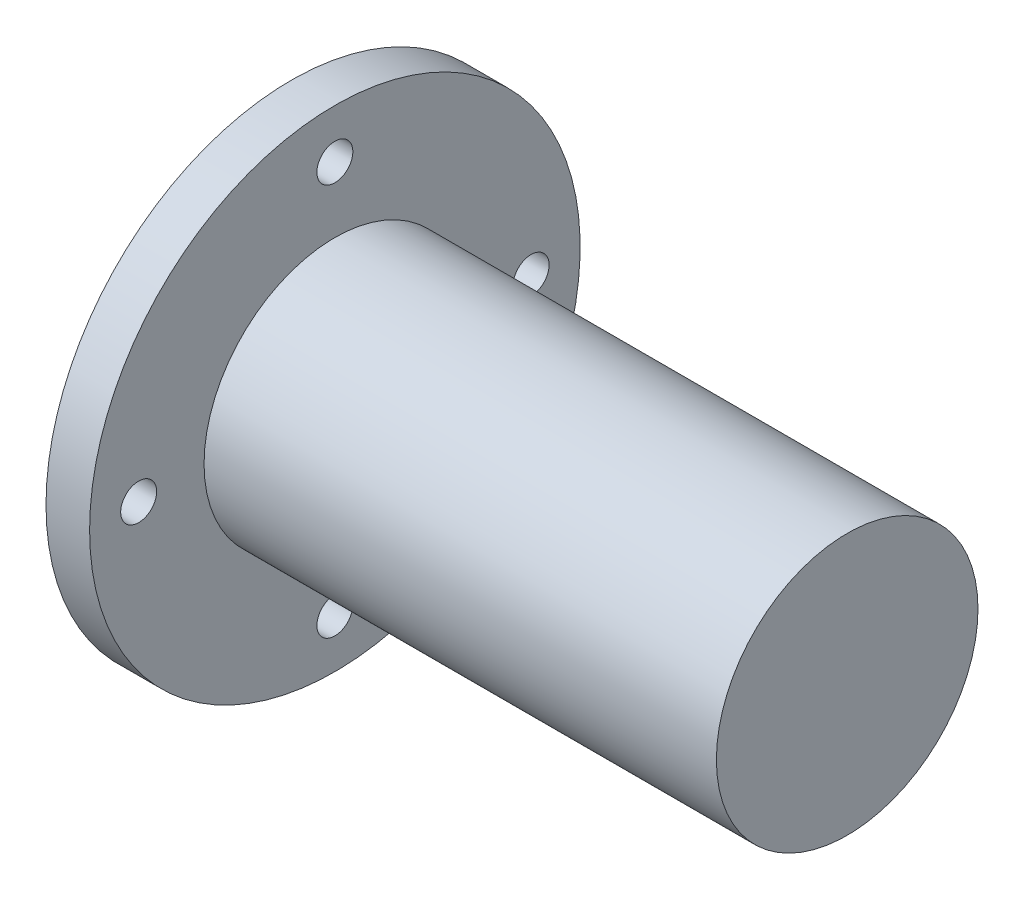
ISO-10303-21;
HEADER;
FILE_DESCRIPTION(('STEP AP214'),'2;1');
FILE_NAME('part.step','',(''),(''),'','','');
FILE_SCHEMA(('AUTOMOTIVE_DESIGN { 1 0 10303 214 1 1 1 1 }'));
ENDSEC;
DATA;
#1=APPLICATION_CONTEXT('core data for automotive mechanical design processes');
#2=APPLICATION_PROTOCOL_DEFINITION('international standard','automotive_design',2000,#1);
#3=PRODUCT_CONTEXT('',#1,'mechanical');
#4=PRODUCT('Part','Part','',(#3));
#5=PRODUCT_RELATED_PRODUCT_CATEGORY('part','',(#4));
#6=PRODUCT_DEFINITION_FORMATION('','',#4);
#7=PRODUCT_DEFINITION_CONTEXT('part definition',#1,'design');
#8=PRODUCT_DEFINITION('design','',#6,#7);
#9=PRODUCT_DEFINITION_SHAPE('','',#8);
#10=(LENGTH_UNIT() NAMED_UNIT(*) SI_UNIT(.MILLI.,.METRE.));
#11=(NAMED_UNIT(*) PLANE_ANGLE_UNIT() SI_UNIT($,.RADIAN.));
#12=(NAMED_UNIT(*) SI_UNIT($,.STERADIAN.) SOLID_ANGLE_UNIT());
#13=UNCERTAINTY_MEASURE_WITH_UNIT(LENGTH_MEASURE(1.E-05),#10,'distance_accuracy_value','');
#14=(GEOMETRIC_REPRESENTATION_CONTEXT(3) GLOBAL_UNCERTAINTY_ASSIGNED_CONTEXT((#13)) GLOBAL_UNIT_ASSIGNED_CONTEXT((#10,
#11,#12)) REPRESENTATION_CONTEXT('',''));
#15=CARTESIAN_POINT('',(0.,0.,0.));
#16=DIRECTION('',(0.,0.,1.));
#17=DIRECTION('',(1.,0.,0.));
#18=AXIS2_PLACEMENT_3D('',#15,#16,#17);
#19=CARTESIAN_POINT('',(39.,0.,0.));
#20=DIRECTION('',(-1.,0.,0.));
#21=DIRECTION('',(0.,0.,1.));
#22=AXIS2_PLACEMENT_3D('',#19,#20,#21);
#23=CYLINDRICAL_SURFACE('',#22,10.);
#24=CARTESIAN_POINT('',(39.,0.,0.));
#25=DIRECTION('',(1.,0.,0.));
#26=DIRECTION('',(0.,0.,-1.));
#27=AXIS2_PLACEMENT_3D('',#24,#25,#26);
#28=CIRCLE('',#27,10.);
#29=CARTESIAN_POINT('',(39.,0.,-10.));
#30=VERTEX_POINT('',#29);
#31=EDGE_CURVE('E10',#30,#30,#28,.T.);
#32=ORIENTED_EDGE('',*,*,#31,.T.);
#33=EDGE_LOOP('',(#32));
#34=FACE_BOUND('',#33,.T.);
#35=CARTESIAN_POINT('',(-11.,0.,0.));
#36=DIRECTION('',(-1.,0.,0.));
#37=DIRECTION('',(0.,0.,1.));
#38=AXIS2_PLACEMENT_3D('',#35,#36,#37);
#39=CIRCLE('',#38,10.);
#40=CARTESIAN_POINT('',(-11.,0.,10.));
#41=VERTEX_POINT('',#40);
#42=EDGE_CURVE('E100',#41,#41,#39,.T.);
#43=ORIENTED_EDGE('',*,*,#42,.T.);
#44=EDGE_LOOP('',(#43));
#45=FACE_BOUND('',#44,.T.);
#46=ADVANCED_FACE('F49',(#34,#45),#23,.F.);
#47=CARTESIAN_POINT('',(39.,0.,0.));
#48=DIRECTION('',(1.,0.,0.));
#49=DIRECTION('',(0.,0.,-1.));
#50=AXIS2_PLACEMENT_3D('',#47,#48,#49);
#51=PLANE('',#50);
#52=ORIENTED_EDGE('',*,*,#31,.F.);
#53=EDGE_LOOP('',(#52));
#54=FACE_BOUND('',#53,.T.);
#55=ADVANCED_FACE('F153',(#54),#51,.F.);
#56=CARTESIAN_POINT('',(-11.,10.,0.));
#57=DIRECTION('',(1.,0.,0.));
#58=DIRECTION('',(0.,0.,-1.));
#59=AXIS2_PLACEMENT_3D('',#56,#57,#58);
#60=PLANE('',#59);
#61=CARTESIAN_POINT('',(-11.,0.,0.));
#62=DIRECTION('',(1.,0.,0.));
#63=DIRECTION('',(0.,0.,-1.));
#64=AXIS2_PLACEMENT_3D('',#61,#62,#63);
#65=CIRCLE('',#64,11.97);
#66=CARTESIAN_POINT('',(-11.,0.,-11.97));
#67=VERTEX_POINT('',#66);
#68=EDGE_CURVE('E64',#67,#67,#65,.F.);
#69=ORIENTED_EDGE('',*,*,#68,.T.);
#70=EDGE_LOOP('',(#69));
#71=FACE_BOUND('',#70,.T.);
#72=ORIENTED_EDGE('',*,*,#42,.F.);
#73=EDGE_LOOP('',(#72));
#74=FACE_BOUND('',#73,.T.);
#75=ADVANCED_FACE('F131',(#71,#74),#60,.F.);
#76=CARTESIAN_POINT('',(-11.,0.,0.));
#77=DIRECTION('',(1.,0.,0.));
#78=DIRECTION('',(0.,0.,-1.));
#79=AXIS2_PLACEMENT_3D('',#76,#77,#78);
#80=CIRCLE('',#79,15.43);
#81=CARTESIAN_POINT('',(-11.,0.,-15.43));
#82=VERTEX_POINT('',#81);
#83=EDGE_CURVE('E72',#82,#82,#80,.T.);
#84=ORIENTED_EDGE('',*,*,#83,.T.);
#85=EDGE_LOOP('',(#84));
#86=FACE_BOUND('',#85,.T.);
#87=CARTESIAN_POINT('',(-11.,18.,0.));
#88=DIRECTION('',(-1.,0.,0.));
#89=DIRECTION('',(0.,0.,1.));
#90=AXIS2_PLACEMENT_3D('',#87,#88,#89);
#91=CIRCLE('',#90,1.64999999999999);
#92=CARTESIAN_POINT('',(-11.,18.,1.64999999999999));
#93=VERTEX_POINT('',#92);
#94=EDGE_CURVE('E120',#93,#93,#91,.T.);
#95=ORIENTED_EDGE('',*,*,#94,.F.);
#96=EDGE_LOOP('',(#95));
#97=FACE_BOUND('',#96,.T.);
#98=CARTESIAN_POINT('',(-11.,0.,18.));
#99=DIRECTION('',(-1.,0.,0.));
#100=DIRECTION('',(0.,0.,1.));
#101=AXIS2_PLACEMENT_3D('',#98,#99,#100);
#102=CIRCLE('',#101,1.64999999999999);
#103=CARTESIAN_POINT('',(-11.,0.,19.65));
#104=VERTEX_POINT('',#103);
#105=EDGE_CURVE('E92',#104,#104,#102,.T.);
#106=ORIENTED_EDGE('',*,*,#105,.F.);
#107=EDGE_LOOP('',(#106));
#108=FACE_BOUND('',#107,.T.);
#109=CARTESIAN_POINT('',(-11.,-18.,0.));
#110=DIRECTION('',(-1.,0.,0.));
#111=DIRECTION('',(0.,0.,1.));
#112=AXIS2_PLACEMENT_3D('',#109,#110,#111);
#113=CIRCLE('',#112,1.64999999999999);
#114=CARTESIAN_POINT('',(-11.,-18.,1.64999999999999));
#115=VERTEX_POINT('',#114);
#116=EDGE_CURVE('E91',#115,#115,#113,.T.);
#117=ORIENTED_EDGE('',*,*,#116,.F.);
#118=EDGE_LOOP('',(#117));
#119=FACE_BOUND('',#118,.T.);
#120=CARTESIAN_POINT('',(-11.,0.,-18.));
#121=DIRECTION('',(-1.,0.,0.));
#122=DIRECTION('',(0.,0.,1.));
#123=AXIS2_PLACEMENT_3D('',#120,#121,#122);
#124=CIRCLE('',#123,1.64999999999999);
#125=CARTESIAN_POINT('',(-11.,0.,-16.35));
#126=VERTEX_POINT('',#125);
#127=EDGE_CURVE('E97',#126,#126,#124,.T.);
#128=ORIENTED_EDGE('',*,*,#127,.F.);
#129=EDGE_LOOP('',(#128));
#130=FACE_BOUND('',#129,.T.);
#131=CARTESIAN_POINT('',(-11.,0.,0.));
#132=DIRECTION('',(-1.,0.,0.));
#133=DIRECTION('',(0.,0.,1.));
#134=AXIS2_PLACEMENT_3D('',#131,#132,#133);
#135=CIRCLE('',#134,22.5);
#136=CARTESIAN_POINT('',(-11.,0.,22.5));
#137=VERTEX_POINT('',#136);
#138=EDGE_CURVE('E96',#137,#137,#135,.T.);
#139=ORIENTED_EDGE('',*,*,#138,.T.);
#140=EDGE_LOOP('',(#139));
#141=FACE_BOUND('',#140,.T.);
#142=ADVANCED_FACE('F127',(#86,#97,#108,#119,#130,#141),#60,.F.);
#143=CARTESIAN_POINT('',(-7.,0.,0.));
#144=DIRECTION('',(-1.,0.,0.));
#145=DIRECTION('',(0.,0.,1.));
#146=AXIS2_PLACEMENT_3D('',#143,#144,#145);
#147=CYLINDRICAL_SURFACE('',#146,22.5);
#148=CARTESIAN_POINT('',(-7.,0.,0.));
#149=DIRECTION('',(-1.,0.,0.));
#150=DIRECTION('',(0.,0.,1.));
#151=AXIS2_PLACEMENT_3D('',#148,#149,#150);
#152=CIRCLE('',#151,22.5);
#153=CARTESIAN_POINT('',(-7.,0.,22.5));
#154=VERTEX_POINT('',#153);
#155=EDGE_CURVE('E103',#154,#154,#152,.T.);
#156=ORIENTED_EDGE('',*,*,#155,.T.);
#157=EDGE_LOOP('',(#156));
#158=FACE_BOUND('',#157,.T.);
#159=ORIENTED_EDGE('',*,*,#138,.F.);
#160=EDGE_LOOP('',(#159));
#161=FACE_BOUND('',#160,.T.);
#162=ADVANCED_FACE('F130',(#158,#161),#147,.T.);
#163=CARTESIAN_POINT('',(-7.,0.,0.));
#164=DIRECTION('',(-1.,0.,0.));
#165=DIRECTION('',(0.,0.,1.));
#166=AXIS2_PLACEMENT_3D('',#163,#164,#165);
#167=PLANE('',#166);
#168=CARTESIAN_POINT('',(-7.,18.,0.));
#169=DIRECTION('',(-1.,0.,0.));
#170=DIRECTION('',(0.,0.,1.));
#171=AXIS2_PLACEMENT_3D('',#168,#169,#170);
#172=CIRCLE('',#171,1.64999999999999);
#173=CARTESIAN_POINT('',(-7.,18.,1.64999999999999));
#174=VERTEX_POINT('',#173);
#175=EDGE_CURVE('E117',#174,#174,#172,.T.);
#176=ORIENTED_EDGE('',*,*,#175,.T.);
#177=EDGE_LOOP('',(#176));
#178=FACE_BOUND('',#177,.T.);
#179=CARTESIAN_POINT('',(-7.,0.,18.));
#180=DIRECTION('',(-1.,0.,0.));
#181=DIRECTION('',(0.,0.,1.));
#182=AXIS2_PLACEMENT_3D('',#179,#180,#181);
#183=CIRCLE('',#182,1.64999999999999);
#184=CARTESIAN_POINT('',(-7.,0.,19.65));
#185=VERTEX_POINT('',#184);
#186=EDGE_CURVE('E88',#185,#185,#183,.T.);
#187=ORIENTED_EDGE('',*,*,#186,.T.);
#188=EDGE_LOOP('',(#187));
#189=FACE_BOUND('',#188,.T.);
#190=CARTESIAN_POINT('',(-7.,-18.,0.));
#191=DIRECTION('',(-1.,0.,0.));
#192=DIRECTION('',(0.,0.,1.));
#193=AXIS2_PLACEMENT_3D('',#190,#191,#192);
#194=CIRCLE('',#193,1.64999999999999);
#195=CARTESIAN_POINT('',(-7.,-18.,1.64999999999999));
#196=VERTEX_POINT('',#195);
#197=EDGE_CURVE('E110',#196,#196,#194,.T.);
#198=ORIENTED_EDGE('',*,*,#197,.T.);
#199=EDGE_LOOP('',(#198));
#200=FACE_BOUND('',#199,.T.);
#201=CARTESIAN_POINT('',(-7.,0.,-18.));
#202=DIRECTION('',(-1.,0.,0.));
#203=DIRECTION('',(0.,0.,1.));
#204=AXIS2_PLACEMENT_3D('',#201,#202,#203);
#205=CIRCLE('',#204,1.64999999999999);
#206=CARTESIAN_POINT('',(-7.,0.,-16.35));
#207=VERTEX_POINT('',#206);
#208=EDGE_CURVE('E93',#207,#207,#205,.T.);
#209=ORIENTED_EDGE('',*,*,#208,.T.);
#210=EDGE_LOOP('',(#209));
#211=FACE_BOUND('',#210,.T.);
#212=CARTESIAN_POINT('',(-7.,0.,0.));
#213=DIRECTION('',(-1.,0.,0.));
#214=DIRECTION('',(0.,0.,1.));
#215=AXIS2_PLACEMENT_3D('',#212,#213,#214);
#216=CIRCLE('',#215,12.);
#217=CARTESIAN_POINT('',(-7.,0.,12.));
#218=VERTEX_POINT('',#217);
#219=EDGE_CURVE('E87',#218,#218,#216,.T.);
#220=ORIENTED_EDGE('',*,*,#219,.T.);
#221=EDGE_LOOP('',(#220));
#222=FACE_BOUND('',#221,.T.);
#223=ORIENTED_EDGE('',*,*,#155,.F.);
#224=EDGE_LOOP('',(#223));
#225=FACE_BOUND('',#224,.T.);
#226=ADVANCED_FACE('F143',(#178,#189,#200,#211,#222,#225),#167,.F.);
#227=CARTESIAN_POINT('',(-11.,0.,-18.));
#228=DIRECTION('',(-1.,0.,0.));
#229=DIRECTION('',(0.,0.,1.));
#230=AXIS2_PLACEMENT_3D('',#227,#228,#229);
#231=CYLINDRICAL_SURFACE('',#230,1.64999999999999);
#232=ORIENTED_EDGE('',*,*,#127,.T.);
#233=EDGE_LOOP('',(#232));
#234=FACE_BOUND('',#233,.T.);
#235=ORIENTED_EDGE('',*,*,#208,.F.);
#236=EDGE_LOOP('',(#235));
#237=FACE_BOUND('',#236,.T.);
#238=ADVANCED_FACE('F149',(#234,#237),#231,.F.);
#239=CARTESIAN_POINT('',(-11.,-18.,0.));
#240=DIRECTION('',(-1.,0.,0.));
#241=DIRECTION('',(0.,0.,1.));
#242=AXIS2_PLACEMENT_3D('',#239,#240,#241);
#243=CYLINDRICAL_SURFACE('',#242,1.64999999999999);
#244=ORIENTED_EDGE('',*,*,#116,.T.);
#245=EDGE_LOOP('',(#244));
#246=FACE_BOUND('',#245,.T.);
#247=ORIENTED_EDGE('',*,*,#197,.F.);
#248=EDGE_LOOP('',(#247));
#249=FACE_BOUND('',#248,.T.);
#250=ADVANCED_FACE('F217',(#246,#249),#243,.F.);
#251=CARTESIAN_POINT('',(-11.,0.,18.));
#252=DIRECTION('',(-1.,0.,0.));
#253=DIRECTION('',(0.,0.,1.));
#254=AXIS2_PLACEMENT_3D('',#251,#252,#253);
#255=CYLINDRICAL_SURFACE('',#254,1.64999999999999);
#256=ORIENTED_EDGE('',*,*,#105,.T.);
#257=EDGE_LOOP('',(#256));
#258=FACE_BOUND('',#257,.T.);
#259=ORIENTED_EDGE('',*,*,#186,.F.);
#260=EDGE_LOOP('',(#259));
#261=FACE_BOUND('',#260,.T.);
#262=ADVANCED_FACE('F214',(#258,#261),#255,.F.);
#263=CARTESIAN_POINT('',(-11.,18.,0.));
#264=DIRECTION('',(-1.,0.,0.));
#265=DIRECTION('',(0.,0.,1.));
#266=AXIS2_PLACEMENT_3D('',#263,#264,#265);
#267=CYLINDRICAL_SURFACE('',#266,1.64999999999999);
#268=ORIENTED_EDGE('',*,*,#94,.T.);
#269=EDGE_LOOP('',(#268));
#270=FACE_BOUND('',#269,.T.);
#271=ORIENTED_EDGE('',*,*,#175,.F.);
#272=EDGE_LOOP('',(#271));
#273=FACE_BOUND('',#272,.T.);
#274=ADVANCED_FACE('F124',(#270,#273),#267,.F.);
#275=CARTESIAN_POINT('',(0.,0.,0.));
#276=DIRECTION('',(1.,0.,0.));
#277=DIRECTION('',(0.,0.,-1.));
#278=AXIS2_PLACEMENT_3D('',#275,#276,#277);
#279=CYLINDRICAL_SURFACE('',#278,12.27);
#280=CARTESIAN_POINT('',(-10.7,0.,0.));
#281=DIRECTION('',(1.,0.,0.));
#282=DIRECTION('',(0.,0.,-1.));
#283=AXIS2_PLACEMENT_3D('',#280,#281,#282);
#284=CIRCLE('',#283,12.27);
#285=CARTESIAN_POINT('',(-10.7,0.,-12.27));
#286=VERTEX_POINT('',#285);
#287=EDGE_CURVE('E60',#286,#286,#284,.T.);
#288=ORIENTED_EDGE('',*,*,#287,.T.);
#289=EDGE_LOOP('',(#288));
#290=FACE_BOUND('',#289,.T.);
#291=CARTESIAN_POINT('',(-9.44,0.,0.));
#292=DIRECTION('',(1.,0.,0.));
#293=DIRECTION('',(0.,0.,-1.));
#294=AXIS2_PLACEMENT_3D('',#291,#292,#293);
#295=CIRCLE('',#294,12.27);
#296=CARTESIAN_POINT('',(-9.44,0.,-12.27));
#297=VERTEX_POINT('',#296);
#298=EDGE_CURVE('E78',#297,#297,#295,.F.);
#299=ORIENTED_EDGE('',*,*,#298,.T.);
#300=EDGE_LOOP('',(#299));
#301=FACE_BOUND('',#300,.T.);
#302=ADVANCED_FACE('F203',(#290,#301),#279,.T.);
#303=CARTESIAN_POINT('',(0.,0.,0.));
#304=DIRECTION('',(1.,0.,0.));
#305=DIRECTION('',(0.,0.,-1.));
#306=AXIS2_PLACEMENT_3D('',#303,#304,#305);
#307=CYLINDRICAL_SURFACE('',#306,15.13);
#308=CARTESIAN_POINT('',(-10.7,0.,0.));
#309=DIRECTION('',(1.,0.,0.));
#310=DIRECTION('',(0.,0.,-1.));
#311=AXIS2_PLACEMENT_3D('',#308,#309,#310);
#312=CIRCLE('',#311,15.13);
#313=CARTESIAN_POINT('',(-10.7,0.,-15.13));
#314=VERTEX_POINT('',#313);
#315=EDGE_CURVE('E69',#314,#314,#312,.F.);
#316=ORIENTED_EDGE('',*,*,#315,.T.);
#317=EDGE_LOOP('',(#316));
#318=FACE_BOUND('',#317,.T.);
#319=CARTESIAN_POINT('',(-9.44,0.,0.));
#320=DIRECTION('',(1.,0.,0.));
#321=DIRECTION('',(0.,0.,-1.));
#322=AXIS2_PLACEMENT_3D('',#319,#320,#321);
#323=CIRCLE('',#322,15.13);
#324=CARTESIAN_POINT('',(-9.44,0.,-15.13));
#325=VERTEX_POINT('',#324);
#326=EDGE_CURVE('E75',#325,#325,#323,.T.);
#327=ORIENTED_EDGE('',*,*,#326,.T.);
#328=EDGE_LOOP('',(#327));
#329=FACE_BOUND('',#328,.T.);
#330=ADVANCED_FACE('F191',(#318,#329),#307,.F.);
#331=CARTESIAN_POINT('',(-9.24,0.,-15.13));
#332=DIRECTION('',(1.,0.,0.));
#333=DIRECTION('',(0.,0.,-1.));
#334=AXIS2_PLACEMENT_3D('',#331,#332,#333);
#335=PLANE('',#334);
#336=CARTESIAN_POINT('',(-9.24,0.,0.));
#337=DIRECTION('',(1.,0.,0.));
#338=DIRECTION('',(0.,0.,-1.));
#339=AXIS2_PLACEMENT_3D('',#336,#337,#338);
#340=CIRCLE('',#339,12.47);
#341=CARTESIAN_POINT('',(-9.24,0.,-12.47));
#342=VERTEX_POINT('',#341);
#343=EDGE_CURVE('E81',#342,#342,#340,.T.);
#344=ORIENTED_EDGE('',*,*,#343,.T.);
#345=EDGE_LOOP('',(#344));
#346=FACE_BOUND('',#345,.T.);
#347=CARTESIAN_POINT('',(-9.24,0.,0.));
#348=DIRECTION('',(1.,0.,0.));
#349=DIRECTION('',(0.,0.,-1.));
#350=AXIS2_PLACEMENT_3D('',#347,#348,#349);
#351=CIRCLE('',#350,14.93);
#352=CARTESIAN_POINT('',(-9.24,0.,-14.93));
#353=VERTEX_POINT('',#352);
#354=EDGE_CURVE('E84',#353,#353,#351,.F.);
#355=ORIENTED_EDGE('',*,*,#354,.T.);
#356=EDGE_LOOP('',(#355));
#357=FACE_BOUND('',#356,.T.);
#358=ADVANCED_FACE('F186',(#346,#357),#335,.F.);
#359=CARTESIAN_POINT('',(-9.44,0.,0.));
#360=DIRECTION('',(1.,0.,0.));
#361=DIRECTION('',(0.,0.,-1.));
#362=AXIS2_PLACEMENT_3D('',#359,#360,#361);
#363=TOROIDAL_SURFACE('',#362,12.47,0.2);
#364=ORIENTED_EDGE('',*,*,#298,.F.);
#365=EDGE_LOOP('',(#364));
#366=FACE_BOUND('',#365,.T.);
#367=ORIENTED_EDGE('',*,*,#343,.F.);
#368=EDGE_LOOP('',(#367));
#369=FACE_BOUND('',#368,.T.);
#370=ADVANCED_FACE('F183',(#366,#369),#363,.F.);
#371=CARTESIAN_POINT('',(-9.44,0.,0.));
#372=DIRECTION('',(1.,0.,0.));
#373=DIRECTION('',(0.,0.,-1.));
#374=AXIS2_PLACEMENT_3D('',#371,#372,#373);
#375=TOROIDAL_SURFACE('',#374,14.93,0.2);
#376=ORIENTED_EDGE('',*,*,#354,.F.);
#377=EDGE_LOOP('',(#376));
#378=FACE_BOUND('',#377,.T.);
#379=ORIENTED_EDGE('',*,*,#326,.F.);
#380=EDGE_LOOP('',(#379));
#381=FACE_BOUND('',#380,.T.);
#382=ADVANCED_FACE('F179',(#378,#381),#375,.F.);
#383=CARTESIAN_POINT('',(-11.,0.,0.));
#384=DIRECTION('',(-1.,0.,0.));
#385=DIRECTION('',(0.,0.,1.));
#386=AXIS2_PLACEMENT_3D('',#383,#384,#385);
#387=CONICAL_SURFACE('',#386,15.43,0.785398163397446);
#388=ORIENTED_EDGE('',*,*,#315,.F.);
#389=EDGE_LOOP('',(#388));
#390=FACE_BOUND('',#389,.T.);
#391=ORIENTED_EDGE('',*,*,#83,.F.);
#392=EDGE_LOOP('',(#391));
#393=FACE_BOUND('',#392,.T.);
#394=ADVANCED_FACE('F173',(#390,#393),#387,.F.);
#395=CARTESIAN_POINT('',(-11.,0.,0.));
#396=DIRECTION('',(1.,0.,0.));
#397=DIRECTION('',(0.,0.,-1.));
#398=AXIS2_PLACEMENT_3D('',#395,#396,#397);
#399=CONICAL_SURFACE('',#398,11.97,0.78539816339744);
#400=ORIENTED_EDGE('',*,*,#287,.F.);
#401=EDGE_LOOP('',(#400));
#402=FACE_BOUND('',#401,.T.);
#403=ORIENTED_EDGE('',*,*,#68,.F.);
#404=EDGE_LOOP('',(#403));
#405=FACE_BOUND('',#404,.T.);
#406=ADVANCED_FACE('F167',(#402,#405),#399,.T.);
#407=CARTESIAN_POINT('',(40.,0.,0.));
#408=DIRECTION('',(1.,0.,0.));
#409=DIRECTION('',(0.,0.,-1.));
#410=AXIS2_PLACEMENT_3D('',#407,#408,#409);
#411=PLANE('',#410);
#412=CARTESIAN_POINT('',(40.,0.,0.));
#413=DIRECTION('',(1.,0.,0.));
#414=DIRECTION('',(0.,0.,-1.));
#415=AXIS2_PLACEMENT_3D('',#412,#413,#414);
#416=CIRCLE('',#415,12.);
#417=CARTESIAN_POINT('',(40.,0.,-12.));
#418=VERTEX_POINT('',#417);
#419=EDGE_CURVE('E56',#418,#418,#416,.T.);
#420=ORIENTED_EDGE('',*,*,#419,.T.);
#421=EDGE_LOOP('',(#420));
#422=FACE_BOUND('',#421,.T.);
#423=ADVANCED_FACE('F51',(#422),#411,.T.);
#424=CARTESIAN_POINT('',(73.9411254969543,0.,0.));
#425=DIRECTION('',(-1.,0.,0.));
#426=DIRECTION('',(0.,0.,1.));
#427=AXIS2_PLACEMENT_3D('',#424,#425,#426);
#428=CYLINDRICAL_SURFACE('',#427,12.);
#429=ORIENTED_EDGE('',*,*,#419,.F.);
#430=EDGE_LOOP('',(#429));
#431=FACE_BOUND('',#430,.T.);
#432=ORIENTED_EDGE('',*,*,#219,.F.);
#433=EDGE_LOOP('',(#432));
#434=FACE_BOUND('',#433,.T.);
#435=ADVANCED_FACE('F162',(#431,#434),#428,.T.);
#436=CLOSED_SHELL('',(#46,#55,#75,#142,#162,#226,#238,#250,#262,#274,#302,#330,#358,#370,#382,
#394,#406,#423,#435));
#437=MANIFOLD_SOLID_BREP('B2',#436);
#438=ADVANCED_BREP_SHAPE_REPRESENTATION('',(#18,#437),#14);
#439=SHAPE_DEFINITION_REPRESENTATION(#9,#438);
ENDSEC;
END-ISO-10303-21;
